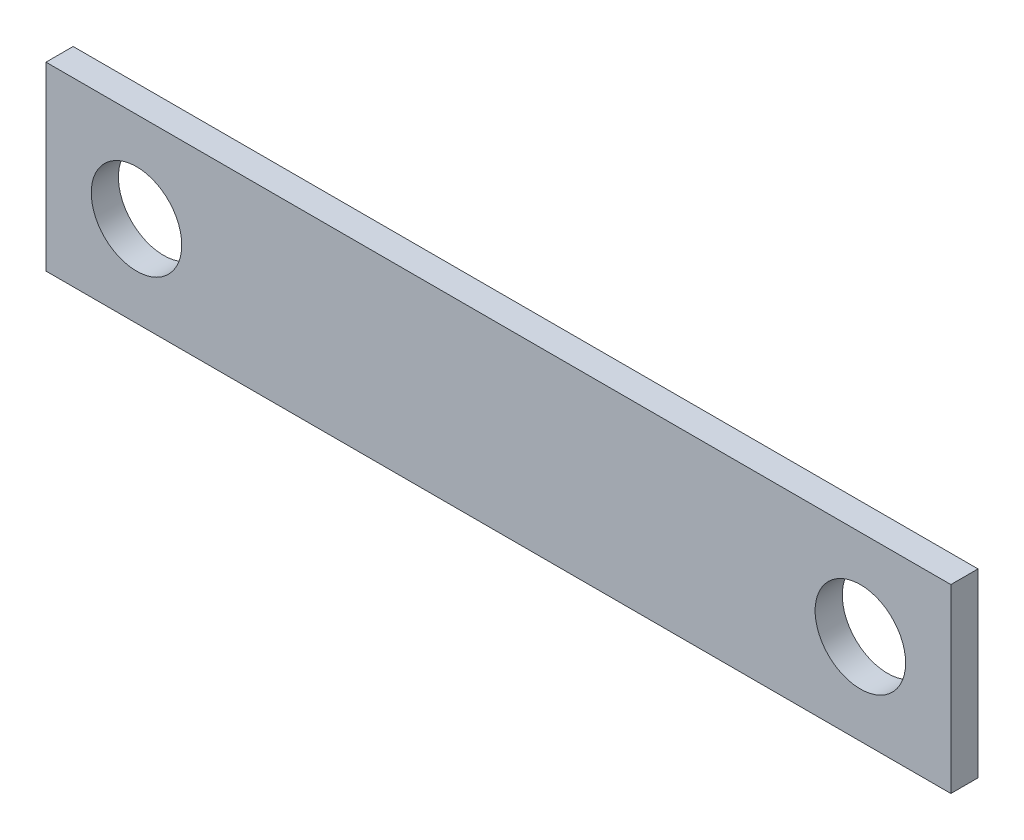
ISO-10303-21;
HEADER;
FILE_DESCRIPTION(('STEP AP214'),'2;1');
FILE_NAME('part.step','',(''),(''),'','','');
FILE_SCHEMA(('AUTOMOTIVE_DESIGN { 1 0 10303 214 1 1 1 1 }'));
ENDSEC;
DATA;
#1=APPLICATION_CONTEXT('core data for automotive mechanical design processes');
#2=APPLICATION_PROTOCOL_DEFINITION('international standard','automotive_design',2000,#1);
#3=PRODUCT_CONTEXT('',#1,'mechanical');
#4=PRODUCT('Part','Part','',(#3));
#5=PRODUCT_RELATED_PRODUCT_CATEGORY('part','',(#4));
#6=PRODUCT_DEFINITION_FORMATION('','',#4);
#7=PRODUCT_DEFINITION_CONTEXT('part definition',#1,'design');
#8=PRODUCT_DEFINITION('design','',#6,#7);
#9=PRODUCT_DEFINITION_SHAPE('','',#8);
#10=(LENGTH_UNIT() NAMED_UNIT(*) SI_UNIT(.MILLI.,.METRE.));
#11=(NAMED_UNIT(*) PLANE_ANGLE_UNIT() SI_UNIT($,.RADIAN.));
#12=(NAMED_UNIT(*) SI_UNIT($,.STERADIAN.) SOLID_ANGLE_UNIT());
#13=UNCERTAINTY_MEASURE_WITH_UNIT(LENGTH_MEASURE(1.E-05),#10,'distance_accuracy_value','');
#14=(GEOMETRIC_REPRESENTATION_CONTEXT(3) GLOBAL_UNCERTAINTY_ASSIGNED_CONTEXT((#13)) GLOBAL_UNIT_ASSIGNED_CONTEXT((#10,
#11,#12)) REPRESENTATION_CONTEXT('',''));
#15=CARTESIAN_POINT('',(0.,0.,0.));
#16=DIRECTION('',(0.,0.,1.));
#17=DIRECTION('',(1.,0.,0.));
#18=AXIS2_PLACEMENT_3D('',#15,#16,#17);
#19=CARTESIAN_POINT('',(0.,0.,3.));
#20=DIRECTION('',(1.,0.,0.));
#21=DIRECTION('',(0.,0.,-1.));
#22=AXIS2_PLACEMENT_3D('',#19,#20,#21);
#23=PLANE('',#22);
#24=DIRECTION('',(0.,-1.,0.));
#25=VECTOR('',#24,1.);
#26=CARTESIAN_POINT('',(0.,0.,0.));
#27=LINE('',#26,#25);
#28=CARTESIAN_POINT('',(0.,20.,0.));
#29=VERTEX_POINT('',#28);
#30=CARTESIAN_POINT('',(0.,0.,0.));
#31=VERTEX_POINT('',#30);
#32=EDGE_CURVE('E95',#29,#31,#27,.T.);
#33=ORIENTED_EDGE('',*,*,#32,.T.);
#34=DIRECTION('',(0.,0.,-1.));
#35=VECTOR('',#34,1.);
#36=CARTESIAN_POINT('',(0.,0.,3.));
#37=LINE('',#36,#35);
#38=CARTESIAN_POINT('',(0.,0.,3.));
#39=VERTEX_POINT('',#38);
#40=EDGE_CURVE('E11',#39,#31,#37,.T.);
#41=ORIENTED_EDGE('',*,*,#40,.F.);
#42=DIRECTION('',(0.,-1.,0.));
#43=VECTOR('',#42,1.);
#44=CARTESIAN_POINT('',(0.,0.,3.));
#45=LINE('',#44,#43);
#46=CARTESIAN_POINT('',(0.,20.,3.));
#47=VERTEX_POINT('',#46);
#48=EDGE_CURVE('E83',#47,#39,#45,.T.);
#49=ORIENTED_EDGE('',*,*,#48,.F.);
#50=DIRECTION('',(0.,0.,-1.));
#51=VECTOR('',#50,1.);
#52=CARTESIAN_POINT('',(0.,20.,3.));
#53=LINE('',#52,#51);
#54=EDGE_CURVE('E91',#47,#29,#53,.T.);
#55=ORIENTED_EDGE('',*,*,#54,.T.);
#56=EDGE_LOOP('',(#33,#41,#49,#55));
#57=FACE_BOUND('',#56,.T.);
#58=ADVANCED_FACE('F32',(#57),#23,.F.);
#59=CARTESIAN_POINT('',(0.,0.,3.));
#60=DIRECTION('',(0.,1.,0.));
#61=DIRECTION('',(0.,0.,1.));
#62=AXIS2_PLACEMENT_3D('',#59,#60,#61);
#63=PLANE('',#62);
#64=DIRECTION('',(1.,0.,0.));
#65=VECTOR('',#64,1.);
#66=CARTESIAN_POINT('',(0.,0.,0.));
#67=LINE('',#66,#65);
#68=CARTESIAN_POINT('',(100.,0.,0.));
#69=VERTEX_POINT('',#68);
#70=EDGE_CURVE('E87',#31,#69,#67,.T.);
#71=ORIENTED_EDGE('',*,*,#70,.T.);
#72=DIRECTION('',(0.,0.,-1.));
#73=VECTOR('',#72,1.);
#74=CARTESIAN_POINT('',(100.,0.,3.));
#75=LINE('',#74,#73);
#76=CARTESIAN_POINT('',(100.,0.,3.));
#77=VERTEX_POINT('',#76);
#78=EDGE_CURVE('E40',#77,#69,#75,.T.);
#79=ORIENTED_EDGE('',*,*,#78,.F.);
#80=DIRECTION('',(1.,0.,0.));
#81=VECTOR('',#80,1.);
#82=CARTESIAN_POINT('',(0.,0.,3.));
#83=LINE('',#82,#81);
#84=EDGE_CURVE('E78',#39,#77,#83,.T.);
#85=ORIENTED_EDGE('',*,*,#84,.F.);
#86=ORIENTED_EDGE('',*,*,#40,.T.);
#87=EDGE_LOOP('',(#71,#79,#85,#86));
#88=FACE_BOUND('',#87,.T.);
#89=ADVANCED_FACE('F86',(#88),#63,.F.);
#90=CARTESIAN_POINT('',(100.,0.,3.));
#91=DIRECTION('',(-1.,0.,0.));
#92=DIRECTION('',(0.,0.,1.));
#93=AXIS2_PLACEMENT_3D('',#90,#91,#92);
#94=PLANE('',#93);
#95=DIRECTION('',(0.,1.,0.));
#96=VECTOR('',#95,1.);
#97=CARTESIAN_POINT('',(100.,0.,0.));
#98=LINE('',#97,#96);
#99=CARTESIAN_POINT('',(100.,20.,0.));
#100=VERTEX_POINT('',#99);
#101=EDGE_CURVE('E65',#69,#100,#98,.T.);
#102=ORIENTED_EDGE('',*,*,#101,.T.);
#103=DIRECTION('',(0.,0.,-1.));
#104=VECTOR('',#103,1.);
#105=CARTESIAN_POINT('',(100.,20.,3.));
#106=LINE('',#105,#104);
#107=CARTESIAN_POINT('',(100.,20.,3.));
#108=VERTEX_POINT('',#107);
#109=EDGE_CURVE('E88',#108,#100,#106,.T.);
#110=ORIENTED_EDGE('',*,*,#109,.F.);
#111=DIRECTION('',(0.,1.,0.));
#112=VECTOR('',#111,1.);
#113=CARTESIAN_POINT('',(100.,0.,3.));
#114=LINE('',#113,#112);
#115=EDGE_CURVE('E81',#77,#108,#114,.T.);
#116=ORIENTED_EDGE('',*,*,#115,.F.);
#117=ORIENTED_EDGE('',*,*,#78,.T.);
#118=EDGE_LOOP('',(#102,#110,#116,#117));
#119=FACE_BOUND('',#118,.T.);
#120=ADVANCED_FACE('F89',(#119),#94,.F.);
#121=CARTESIAN_POINT('',(0.,20.,3.));
#122=DIRECTION('',(0.,-1.,0.));
#123=DIRECTION('',(0.,0.,-1.));
#124=AXIS2_PLACEMENT_3D('',#121,#122,#123);
#125=PLANE('',#124);
#126=DIRECTION('',(-1.,0.,0.));
#127=VECTOR('',#126,1.);
#128=CARTESIAN_POINT('',(0.,20.,0.));
#129=LINE('',#128,#127);
#130=EDGE_CURVE('E71',#100,#29,#129,.T.);
#131=ORIENTED_EDGE('',*,*,#130,.T.);
#132=ORIENTED_EDGE('',*,*,#54,.F.);
#133=DIRECTION('',(-1.,0.,0.));
#134=VECTOR('',#133,1.);
#135=CARTESIAN_POINT('',(0.,20.,3.));
#136=LINE('',#135,#134);
#137=EDGE_CURVE('E48',#108,#47,#136,.T.);
#138=ORIENTED_EDGE('',*,*,#137,.F.);
#139=ORIENTED_EDGE('',*,*,#109,.T.);
#140=EDGE_LOOP('',(#131,#132,#138,#139));
#141=FACE_BOUND('',#140,.T.);
#142=ADVANCED_FACE('F103',(#141),#125,.F.);
#143=CARTESIAN_POINT('',(0.,0.,3.));
#144=DIRECTION('',(0.,0.,-1.));
#145=DIRECTION('',(-1.,0.,0.));
#146=AXIS2_PLACEMENT_3D('',#143,#144,#145);
#147=PLANE('',#146);
#148=CARTESIAN_POINT('',(90.,10.,3.));
#149=DIRECTION('',(0.,0.,1.));
#150=DIRECTION('',(1.,0.,0.));
#151=AXIS2_PLACEMENT_3D('',#148,#149,#150);
#152=CIRCLE('',#151,5.);
#153=CARTESIAN_POINT('',(95.,10.,3.));
#154=VERTEX_POINT('',#153);
#155=EDGE_CURVE('E115',#154,#154,#152,.T.);
#156=ORIENTED_EDGE('',*,*,#155,.F.);
#157=EDGE_LOOP('',(#156));
#158=FACE_BOUND('',#157,.T.);
#159=CARTESIAN_POINT('',(10.,10.,3.));
#160=DIRECTION('',(0.,0.,1.));
#161=DIRECTION('',(1.,0.,0.));
#162=AXIS2_PLACEMENT_3D('',#159,#160,#161);
#163=CIRCLE('',#162,5.);
#164=CARTESIAN_POINT('',(15.,10.,3.));
#165=VERTEX_POINT('',#164);
#166=EDGE_CURVE('E109',#165,#165,#163,.T.);
#167=ORIENTED_EDGE('',*,*,#166,.F.);
#168=EDGE_LOOP('',(#167));
#169=FACE_BOUND('',#168,.T.);
#170=ORIENTED_EDGE('',*,*,#48,.T.);
#171=ORIENTED_EDGE('',*,*,#84,.T.);
#172=ORIENTED_EDGE('',*,*,#115,.T.);
#173=ORIENTED_EDGE('',*,*,#137,.T.);
#174=EDGE_LOOP('',(#170,#171,#172,#173));
#175=FACE_BOUND('',#174,.T.);
#176=ADVANCED_FACE('F79',(#158,#169,#175),#147,.F.);
#177=CARTESIAN_POINT('',(0.,0.,0.));
#178=DIRECTION('',(0.,0.,-1.));
#179=DIRECTION('',(-1.,0.,0.));
#180=AXIS2_PLACEMENT_3D('',#177,#178,#179);
#181=PLANE('',#180);
#182=CARTESIAN_POINT('',(90.,10.,0.));
#183=DIRECTION('',(0.,0.,1.));
#184=DIRECTION('',(1.,0.,0.));
#185=AXIS2_PLACEMENT_3D('',#182,#183,#184);
#186=CIRCLE('',#185,5.);
#187=CARTESIAN_POINT('',(95.,10.,0.));
#188=VERTEX_POINT('',#187);
#189=EDGE_CURVE('E112',#188,#188,#186,.T.);
#190=ORIENTED_EDGE('',*,*,#189,.T.);
#191=EDGE_LOOP('',(#190));
#192=FACE_BOUND('',#191,.T.);
#193=CARTESIAN_POINT('',(10.,10.,0.));
#194=DIRECTION('',(0.,0.,1.));
#195=DIRECTION('',(1.,0.,0.));
#196=AXIS2_PLACEMENT_3D('',#193,#194,#195);
#197=CIRCLE('',#196,5.);
#198=CARTESIAN_POINT('',(15.,10.,0.));
#199=VERTEX_POINT('',#198);
#200=EDGE_CURVE('E98',#199,#199,#197,.T.);
#201=ORIENTED_EDGE('',*,*,#200,.T.);
#202=EDGE_LOOP('',(#201));
#203=FACE_BOUND('',#202,.T.);
#204=ORIENTED_EDGE('',*,*,#32,.F.);
#205=ORIENTED_EDGE('',*,*,#130,.F.);
#206=ORIENTED_EDGE('',*,*,#101,.F.);
#207=ORIENTED_EDGE('',*,*,#70,.F.);
#208=EDGE_LOOP('',(#204,#205,#206,#207));
#209=FACE_BOUND('',#208,.T.);
#210=ADVANCED_FACE('F106',(#192,#203,#209),#181,.T.);
#211=CARTESIAN_POINT('',(10.,10.,0.));
#212=DIRECTION('',(0.,0.,1.));
#213=DIRECTION('',(1.,0.,0.));
#214=AXIS2_PLACEMENT_3D('',#211,#212,#213);
#215=CYLINDRICAL_SURFACE('',#214,5.);
#216=ORIENTED_EDGE('',*,*,#200,.F.);
#217=EDGE_LOOP('',(#216));
#218=FACE_BOUND('',#217,.T.);
#219=ORIENTED_EDGE('',*,*,#166,.T.);
#220=EDGE_LOOP('',(#219));
#221=FACE_BOUND('',#220,.T.);
#222=ADVANCED_FACE('F126',(#218,#221),#215,.F.);
#223=CARTESIAN_POINT('',(90.,10.,0.));
#224=DIRECTION('',(0.,0.,1.));
#225=DIRECTION('',(1.,0.,0.));
#226=AXIS2_PLACEMENT_3D('',#223,#224,#225);
#227=CYLINDRICAL_SURFACE('',#226,5.);
#228=ORIENTED_EDGE('',*,*,#189,.F.);
#229=EDGE_LOOP('',(#228));
#230=FACE_BOUND('',#229,.T.);
#231=ORIENTED_EDGE('',*,*,#155,.T.);
#232=EDGE_LOOP('',(#231));
#233=FACE_BOUND('',#232,.T.);
#234=ADVANCED_FACE('F123',(#230,#233),#227,.F.);
#235=CLOSED_SHELL('',(#58,#89,#120,#142,#176,#210,#222,#234));
#236=MANIFOLD_SOLID_BREP('B2',#235);
#237=ADVANCED_BREP_SHAPE_REPRESENTATION('',(#18,#236),#14);
#238=SHAPE_DEFINITION_REPRESENTATION(#9,#237);
ENDSEC;
END-ISO-10303-21;
